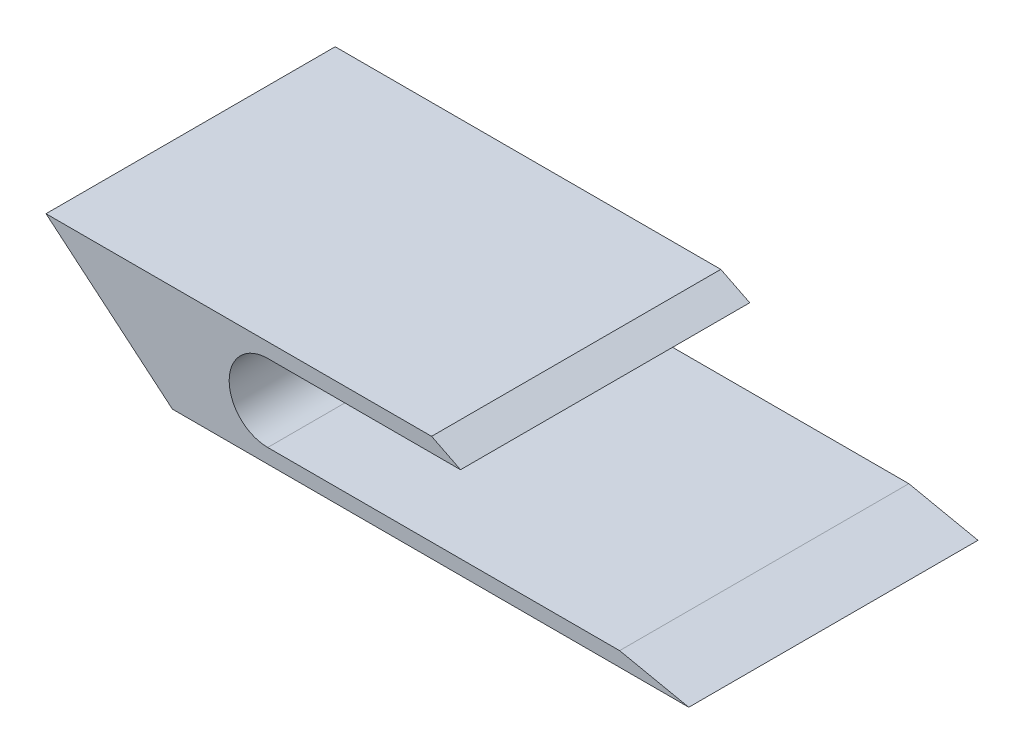
ISO-10303-21;
HEADER;
FILE_DESCRIPTION(('STEP AP214'),'2;1');
FILE_NAME('part.step','',(''),(''),'','','');
FILE_SCHEMA(('AUTOMOTIVE_DESIGN { 1 0 10303 214 1 1 1 1 }'));
ENDSEC;
DATA;
#1=APPLICATION_CONTEXT('core data for automotive mechanical design processes');
#2=APPLICATION_PROTOCOL_DEFINITION('international standard','automotive_design',2000,#1);
#3=PRODUCT_CONTEXT('',#1,'mechanical');
#4=PRODUCT('Part','Part','',(#3));
#5=PRODUCT_RELATED_PRODUCT_CATEGORY('part','',(#4));
#6=PRODUCT_DEFINITION_FORMATION('','',#4);
#7=PRODUCT_DEFINITION_CONTEXT('part definition',#1,'design');
#8=PRODUCT_DEFINITION('design','',#6,#7);
#9=PRODUCT_DEFINITION_SHAPE('','',#8);
#10=(LENGTH_UNIT() NAMED_UNIT(*) SI_UNIT(.MILLI.,.METRE.));
#11=(NAMED_UNIT(*) PLANE_ANGLE_UNIT() SI_UNIT($,.RADIAN.));
#12=(NAMED_UNIT(*) SI_UNIT($,.STERADIAN.) SOLID_ANGLE_UNIT());
#13=UNCERTAINTY_MEASURE_WITH_UNIT(LENGTH_MEASURE(1.E-05),#10,'distance_accuracy_value','');
#14=(GEOMETRIC_REPRESENTATION_CONTEXT(3) GLOBAL_UNCERTAINTY_ASSIGNED_CONTEXT((#13)) GLOBAL_UNIT_ASSIGNED_CONTEXT((#10,
#11,#12)) REPRESENTATION_CONTEXT('',''));
#15=CARTESIAN_POINT('',(0.,0.,0.));
#16=DIRECTION('',(0.,0.,1.));
#17=DIRECTION('',(1.,0.,0.));
#18=AXIS2_PLACEMENT_3D('',#15,#16,#17);
#19=CARTESIAN_POINT('',(-23.0004353741516,5.49999999999999,30.));
#20=DIRECTION('',(0.642787609686535,0.766044443118982,0.));
#21=DIRECTION('',(-0.766044443118982,0.642787609686535,0.));
#22=AXIS2_PLACEMENT_3D('',#19,#20,#21);
#23=PLANE('',#22);
#24=DIRECTION('',(0.766044443118982,-0.642787609686535,0.));
#25=VECTOR('',#24,1.);
#26=CARTESIAN_POINT('',(-23.0004353741516,5.49999999999999,0.));
#27=LINE('',#26,#25);
#28=CARTESIAN_POINT('',(-23.0004353741516,5.49999999999999,0.));
#29=VERTEX_POINT('',#28);
#30=CARTESIAN_POINT('',(-9.89114585561514,-5.50000000000001,0.));
#31=VERTEX_POINT('',#30);
#32=EDGE_CURVE('E129',#29,#31,#27,.T.);
#33=ORIENTED_EDGE('',*,*,#32,.T.);
#34=DIRECTION('',(0.,0.,-1.));
#35=VECTOR('',#34,1.);
#36=CARTESIAN_POINT('',(-9.89114585561514,-5.50000000000001,30.));
#37=LINE('',#36,#35);
#38=CARTESIAN_POINT('',(-9.89114585561514,-5.50000000000001,30.));
#39=VERTEX_POINT('',#38);
#40=EDGE_CURVE('E11',#39,#31,#37,.T.);
#41=ORIENTED_EDGE('',*,*,#40,.F.);
#42=DIRECTION('',(0.766044443118982,-0.642787609686535,0.));
#43=VECTOR('',#42,1.);
#44=CARTESIAN_POINT('',(-23.0004353741516,5.49999999999999,30.));
#45=LINE('',#44,#43);
#46=CARTESIAN_POINT('',(-23.0004353741516,5.49999999999999,30.));
#47=VERTEX_POINT('',#46);
#48=EDGE_CURVE('E143',#47,#39,#45,.T.);
#49=ORIENTED_EDGE('',*,*,#48,.F.);
#50=DIRECTION('',(0.,0.,-1.));
#51=VECTOR('',#50,1.);
#52=CARTESIAN_POINT('',(-23.0004353741516,5.49999999999999,30.));
#53=LINE('',#52,#51);
#54=EDGE_CURVE('E125',#47,#29,#53,.T.);
#55=ORIENTED_EDGE('',*,*,#54,.T.);
#56=EDGE_LOOP('',(#33,#41,#49,#55));
#57=FACE_BOUND('',#56,.T.);
#58=ADVANCED_FACE('F33',(#57),#23,.F.);
#59=CARTESIAN_POINT('',(43.6795683586563,-5.5,30.));
#60=DIRECTION('',(0.,1.,0.));
#61=DIRECTION('',(-1.,0.,0.));
#62=AXIS2_PLACEMENT_3D('',#59,#60,#61);
#63=PLANE('',#62);
#64=DIRECTION('',(1.,0.,0.));
#65=VECTOR('',#64,1.);
#66=CARTESIAN_POINT('',(43.6795683586563,-5.5,0.));
#67=LINE('',#66,#65);
#68=CARTESIAN_POINT('',(43.6795683586563,-5.5,0.));
#69=VERTEX_POINT('',#68);
#70=EDGE_CURVE('E132',#31,#69,#67,.T.);
#71=ORIENTED_EDGE('',*,*,#70,.T.);
#72=DIRECTION('',(0.,0.,-1.));
#73=VECTOR('',#72,1.);
#74=CARTESIAN_POINT('',(43.6795683586563,-5.5,30.));
#75=LINE('',#74,#73);
#76=CARTESIAN_POINT('',(43.6795683586563,-5.5,30.));
#77=VERTEX_POINT('',#76);
#78=EDGE_CURVE('E41',#77,#69,#75,.T.);
#79=ORIENTED_EDGE('',*,*,#78,.F.);
#80=DIRECTION('',(1.,0.,0.));
#81=VECTOR('',#80,1.);
#82=CARTESIAN_POINT('',(43.6795683586563,-5.5,30.));
#83=LINE('',#82,#81);
#84=EDGE_CURVE('E92',#39,#77,#83,.T.);
#85=ORIENTED_EDGE('',*,*,#84,.F.);
#86=ORIENTED_EDGE('',*,*,#40,.T.);
#87=EDGE_LOOP('',(#71,#79,#85,#86));
#88=FACE_BOUND('',#87,.T.);
#89=ADVANCED_FACE('F178',(#88),#63,.F.);
#90=CARTESIAN_POINT('',(43.6795683586563,-5.5,30.));
#91=DIRECTION('',(-0.204608866499897,-0.978843813766848,0.));
#92=DIRECTION('',(0.978843813766848,-0.204608866499897,0.));
#93=AXIS2_PLACEMENT_3D('',#90,#91,#92);
#94=PLANE('',#93);
#95=DIRECTION('',(-0.978843813766848,0.204608866499897,0.));
#96=VECTOR('',#95,1.);
#97=CARTESIAN_POINT('',(43.6795683586563,-5.5,0.));
#98=LINE('',#97,#96);
#99=CARTESIAN_POINT('',(36.5036050401213,-4.,0.));
#100=VERTEX_POINT('',#99);
#101=EDGE_CURVE('E134',#69,#100,#98,.T.);
#102=ORIENTED_EDGE('',*,*,#101,.T.);
#103=DIRECTION('',(0.,0.,-1.));
#104=VECTOR('',#103,1.);
#105=CARTESIAN_POINT('',(36.5036050401213,-4.,30.));
#106=LINE('',#105,#104);
#107=CARTESIAN_POINT('',(36.5036050401213,-4.,30.));
#108=VERTEX_POINT('',#107);
#109=EDGE_CURVE('E150',#108,#100,#106,.T.);
#110=ORIENTED_EDGE('',*,*,#109,.F.);
#111=DIRECTION('',(-0.978843813766848,0.204608866499897,0.));
#112=VECTOR('',#111,1.);
#113=CARTESIAN_POINT('',(43.6795683586563,-5.5,30.));
#114=LINE('',#113,#112);
#115=EDGE_CURVE('E158',#77,#108,#114,.T.);
#116=ORIENTED_EDGE('',*,*,#115,.F.);
#117=ORIENTED_EDGE('',*,*,#78,.T.);
#118=EDGE_LOOP('',(#102,#110,#116,#117));
#119=FACE_BOUND('',#118,.T.);
#120=ADVANCED_FACE('F156',(#119),#94,.F.);
#121=CARTESIAN_POINT('',(0.,-4.,30.));
#122=DIRECTION('',(0.,-1.,0.));
#123=DIRECTION('',(0.,0.,-1.));
#124=AXIS2_PLACEMENT_3D('',#121,#122,#123);
#125=PLANE('',#124);
#126=DIRECTION('',(-1.,0.,0.));
#127=VECTOR('',#126,1.);
#128=CARTESIAN_POINT('',(0.,-4.,0.));
#129=LINE('',#128,#127);
#130=CARTESIAN_POINT('',(0.,-4.,0.));
#131=VERTEX_POINT('',#130);
#132=EDGE_CURVE('E136',#100,#131,#129,.T.);
#133=ORIENTED_EDGE('',*,*,#132,.T.);
#134=DIRECTION('',(0.,0.,-1.));
#135=VECTOR('',#134,1.);
#136=CARTESIAN_POINT('',(0.,-4.,30.));
#137=LINE('',#136,#135);
#138=CARTESIAN_POINT('',(0.,-4.,30.));
#139=VERTEX_POINT('',#138);
#140=EDGE_CURVE('E147',#139,#131,#137,.T.);
#141=ORIENTED_EDGE('',*,*,#140,.F.);
#142=DIRECTION('',(-1.,0.,0.));
#143=VECTOR('',#142,1.);
#144=CARTESIAN_POINT('',(0.,-4.,30.));
#145=LINE('',#144,#143);
#146=EDGE_CURVE('E170',#108,#139,#145,.T.);
#147=ORIENTED_EDGE('',*,*,#146,.F.);
#148=ORIENTED_EDGE('',*,*,#109,.T.);
#149=EDGE_LOOP('',(#133,#141,#147,#148));
#150=FACE_BOUND('',#149,.T.);
#151=ADVANCED_FACE('F166',(#150),#125,.F.);
#152=CARTESIAN_POINT('',(0.,0.,30.));
#153=DIRECTION('',(0.,0.,-1.));
#154=DIRECTION('',(-1.,0.,0.));
#155=AXIS2_PLACEMENT_3D('',#152,#153,#154);
#156=CYLINDRICAL_SURFACE('',#155,4.);
#157=CARTESIAN_POINT('',(0.,0.,0.));
#158=DIRECTION('',(0.,0.,-1.));
#159=DIRECTION('',(1.,0.,0.));
#160=AXIS2_PLACEMENT_3D('',#157,#158,#159);
#161=CIRCLE('',#160,4.);
#162=CARTESIAN_POINT('',(0.,4.,0.));
#163=VERTEX_POINT('',#162);
#164=EDGE_CURVE('E138',#131,#163,#161,.T.);
#165=ORIENTED_EDGE('',*,*,#164,.T.);
#166=DIRECTION('',(0.,0.,-1.));
#167=VECTOR('',#166,1.);
#168=CARTESIAN_POINT('',(0.,4.,30.));
#169=LINE('',#168,#167);
#170=CARTESIAN_POINT('',(0.,4.,30.));
#171=VERTEX_POINT('',#170);
#172=EDGE_CURVE('E120',#171,#163,#169,.T.);
#173=ORIENTED_EDGE('',*,*,#172,.F.);
#174=CARTESIAN_POINT('',(0.,0.,30.));
#175=DIRECTION('',(0.,0.,-1.));
#176=DIRECTION('',(1.,0.,0.));
#177=AXIS2_PLACEMENT_3D('',#174,#175,#176);
#178=CIRCLE('',#177,4.);
#179=EDGE_CURVE('E111',#139,#171,#178,.T.);
#180=ORIENTED_EDGE('',*,*,#179,.F.);
#181=ORIENTED_EDGE('',*,*,#140,.T.);
#182=EDGE_LOOP('',(#165,#173,#180,#181));
#183=FACE_BOUND('',#182,.T.);
#184=ADVANCED_FACE('F169',(#183),#156,.F.);
#185=CARTESIAN_POINT('',(0.,4.,30.));
#186=DIRECTION('',(0.,1.,0.));
#187=DIRECTION('',(0.,0.,1.));
#188=AXIS2_PLACEMENT_3D('',#185,#186,#187);
#189=PLANE('',#188);
#190=DIRECTION('',(1.,0.,0.));
#191=VECTOR('',#190,1.);
#192=CARTESIAN_POINT('',(0.,4.,0.));
#193=LINE('',#192,#191);
#194=CARTESIAN_POINT('',(20.,4.,0.));
#195=VERTEX_POINT('',#194);
#196=EDGE_CURVE('E119',#163,#195,#193,.T.);
#197=ORIENTED_EDGE('',*,*,#196,.T.);
#198=DIRECTION('',(0.,0.,-1.));
#199=VECTOR('',#198,1.);
#200=CARTESIAN_POINT('',(20.,4.,30.));
#201=LINE('',#200,#199);
#202=CARTESIAN_POINT('',(20.,4.,30.));
#203=VERTEX_POINT('',#202);
#204=EDGE_CURVE('E116',#203,#195,#201,.T.);
#205=ORIENTED_EDGE('',*,*,#204,.F.);
#206=DIRECTION('',(1.,0.,0.));
#207=VECTOR('',#206,1.);
#208=CARTESIAN_POINT('',(0.,4.,30.));
#209=LINE('',#208,#207);
#210=EDGE_CURVE('E105',#171,#203,#209,.T.);
#211=ORIENTED_EDGE('',*,*,#210,.F.);
#212=ORIENTED_EDGE('',*,*,#172,.T.);
#213=EDGE_LOOP('',(#197,#205,#211,#212));
#214=FACE_BOUND('',#213,.T.);
#215=ADVANCED_FACE('F117',(#214),#189,.F.);
#216=CARTESIAN_POINT('',(16.9995646258484,5.5,30.));
#217=DIRECTION('',(-0.447161679376813,-0.894453147178156,0.));
#218=DIRECTION('',(0.894453147178156,-0.447161679376813,0.));
#219=AXIS2_PLACEMENT_3D('',#216,#217,#218);
#220=PLANE('',#219);
#221=DIRECTION('',(-0.894453147178156,0.447161679376813,0.));
#222=VECTOR('',#221,1.);
#223=CARTESIAN_POINT('',(16.9995646258484,5.5,0.));
#224=LINE('',#223,#222);
#225=CARTESIAN_POINT('',(16.9995646258484,5.5,0.));
#226=VERTEX_POINT('',#225);
#227=EDGE_CURVE('E78',#195,#226,#224,.T.);
#228=ORIENTED_EDGE('',*,*,#227,.T.);
#229=DIRECTION('',(0.,0.,-1.));
#230=VECTOR('',#229,1.);
#231=CARTESIAN_POINT('',(16.9995646258484,5.5,30.));
#232=LINE('',#231,#230);
#233=CARTESIAN_POINT('',(16.9995646258484,5.5,30.));
#234=VERTEX_POINT('',#233);
#235=EDGE_CURVE('E121',#234,#226,#232,.T.);
#236=ORIENTED_EDGE('',*,*,#235,.F.);
#237=DIRECTION('',(-0.894453147178156,0.447161679376813,0.));
#238=VECTOR('',#237,1.);
#239=CARTESIAN_POINT('',(16.9995646258484,5.5,30.));
#240=LINE('',#239,#238);
#241=EDGE_CURVE('E109',#203,#234,#240,.T.);
#242=ORIENTED_EDGE('',*,*,#241,.F.);
#243=ORIENTED_EDGE('',*,*,#204,.T.);
#244=EDGE_LOOP('',(#228,#236,#242,#243));
#245=FACE_BOUND('',#244,.T.);
#246=ADVANCED_FACE('F123',(#245),#220,.F.);
#247=CARTESIAN_POINT('',(16.9995646258484,5.5,30.));
#248=DIRECTION('',(0.,-1.,0.));
#249=DIRECTION('',(1.,0.,0.));
#250=AXIS2_PLACEMENT_3D('',#247,#248,#249);
#251=PLANE('',#250);
#252=DIRECTION('',(-1.,0.,0.));
#253=VECTOR('',#252,1.);
#254=CARTESIAN_POINT('',(16.9995646258484,5.5,0.));
#255=LINE('',#254,#253);
#256=EDGE_CURVE('E84',#226,#29,#255,.T.);
#257=ORIENTED_EDGE('',*,*,#256,.T.);
#258=ORIENTED_EDGE('',*,*,#54,.F.);
#259=DIRECTION('',(-1.,0.,0.));
#260=VECTOR('',#259,1.);
#261=CARTESIAN_POINT('',(16.9995646258484,5.5,30.));
#262=LINE('',#261,#260);
#263=EDGE_CURVE('E49',#234,#47,#262,.T.);
#264=ORIENTED_EDGE('',*,*,#263,.F.);
#265=ORIENTED_EDGE('',*,*,#235,.T.);
#266=EDGE_LOOP('',(#257,#258,#264,#265));
#267=FACE_BOUND('',#266,.T.);
#268=ADVANCED_FACE('F194',(#267),#251,.F.);
#269=CARTESIAN_POINT('',(0.,0.,30.));
#270=DIRECTION('',(0.,0.,1.));
#271=DIRECTION('',(1.,0.,0.));
#272=AXIS2_PLACEMENT_3D('',#269,#270,#271);
#273=PLANE('',#272);
#274=ORIENTED_EDGE('',*,*,#48,.T.);
#275=ORIENTED_EDGE('',*,*,#84,.T.);
#276=ORIENTED_EDGE('',*,*,#115,.T.);
#277=ORIENTED_EDGE('',*,*,#146,.T.);
#278=ORIENTED_EDGE('',*,*,#179,.T.);
#279=ORIENTED_EDGE('',*,*,#210,.T.);
#280=ORIENTED_EDGE('',*,*,#241,.T.);
#281=ORIENTED_EDGE('',*,*,#263,.T.);
#282=EDGE_LOOP('',(#274,#275,#276,#277,#278,#279,#280,#281));
#283=FACE_BOUND('',#282,.T.);
#284=ADVANCED_FACE('F107',(#283),#273,.T.);
#285=CARTESIAN_POINT('',(0.,0.,0.));
#286=DIRECTION('',(0.,0.,1.));
#287=DIRECTION('',(1.,0.,0.));
#288=AXIS2_PLACEMENT_3D('',#285,#286,#287);
#289=PLANE('',#288);
#290=ORIENTED_EDGE('',*,*,#32,.F.);
#291=ORIENTED_EDGE('',*,*,#256,.F.);
#292=ORIENTED_EDGE('',*,*,#227,.F.);
#293=ORIENTED_EDGE('',*,*,#196,.F.);
#294=ORIENTED_EDGE('',*,*,#164,.F.);
#295=ORIENTED_EDGE('',*,*,#132,.F.);
#296=ORIENTED_EDGE('',*,*,#101,.F.);
#297=ORIENTED_EDGE('',*,*,#70,.F.);
#298=EDGE_LOOP('',(#290,#291,#292,#293,#294,#295,#296,#297));
#299=FACE_BOUND('',#298,.T.);
#300=ADVANCED_FACE('F162',(#299),#289,.F.);
#301=CLOSED_SHELL('',(#58,#89,#120,#151,#184,#215,#246,#268,#284,#300));
#302=MANIFOLD_SOLID_BREP('B2',#301);
#303=ADVANCED_BREP_SHAPE_REPRESENTATION('',(#18,#302),#14);
#304=SHAPE_DEFINITION_REPRESENTATION(#9,#303);
ENDSEC;
END-ISO-10303-21;
